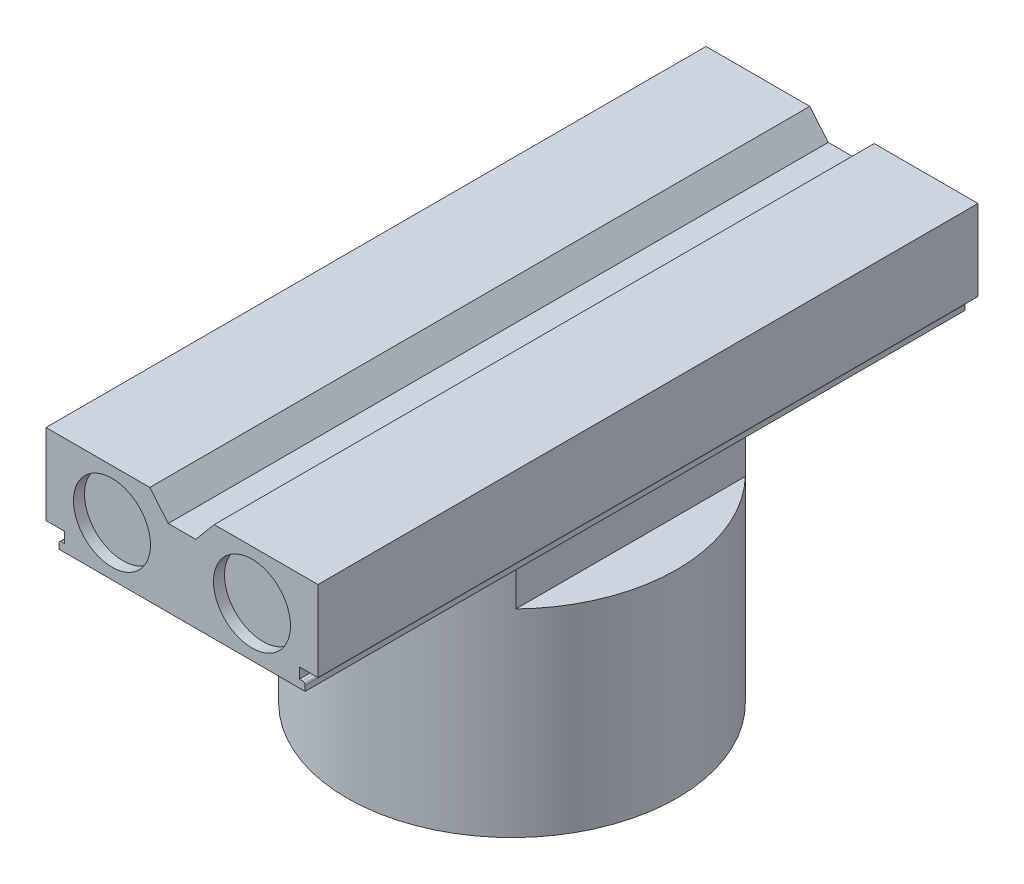
ISO-10303-21;
HEADER;
FILE_DESCRIPTION(('STEP AP214'),'2;1');
FILE_NAME('part.step','',(''),(''),'','','');
FILE_SCHEMA(('AUTOMOTIVE_DESIGN { 1 0 10303 214 1 1 1 1 }'));
ENDSEC;
DATA;
#1=APPLICATION_CONTEXT('core data for automotive mechanical design processes');
#2=APPLICATION_PROTOCOL_DEFINITION('international standard','automotive_design',2000,#1);
#3=PRODUCT_CONTEXT('',#1,'mechanical');
#4=PRODUCT('Part','Part','',(#3));
#5=PRODUCT_RELATED_PRODUCT_CATEGORY('part','',(#4));
#6=PRODUCT_DEFINITION_FORMATION('','',#4);
#7=PRODUCT_DEFINITION_CONTEXT('part definition',#1,'design');
#8=PRODUCT_DEFINITION('design','',#6,#7);
#9=PRODUCT_DEFINITION_SHAPE('','',#8);
#10=(LENGTH_UNIT() NAMED_UNIT(*) SI_UNIT(.MILLI.,.METRE.));
#11=(NAMED_UNIT(*) PLANE_ANGLE_UNIT() SI_UNIT($,.RADIAN.));
#12=(NAMED_UNIT(*) SI_UNIT($,.STERADIAN.) SOLID_ANGLE_UNIT());
#13=UNCERTAINTY_MEASURE_WITH_UNIT(LENGTH_MEASURE(1.E-05),#10,'distance_accuracy_value','');
#14=(GEOMETRIC_REPRESENTATION_CONTEXT(3) GLOBAL_UNCERTAINTY_ASSIGNED_CONTEXT((#13)) GLOBAL_UNIT_ASSIGNED_CONTEXT((#10,
#11,#12)) REPRESENTATION_CONTEXT('',''));
#15=CARTESIAN_POINT('',(0.,0.,0.));
#16=DIRECTION('',(0.,0.,1.));
#17=DIRECTION('',(1.,0.,0.));
#18=AXIS2_PLACEMENT_3D('',#15,#16,#17);
#19=CARTESIAN_POINT('',(24.7249393998215,4.00000000000023,59.9999999999995));
#20=DIRECTION('',(0.,1.,0.));
#21=DIRECTION('',(-1.,0.,0.));
#22=AXIS2_PLACEMENT_3D('',#19,#20,#21);
#23=PLANE('',#22);
#24=DIRECTION('',(0.,0.,1.));
#25=VECTOR('',#24,1.);
#26=CARTESIAN_POINT('',(5.85639852470913,4.00000000000023,59.9999999999995));
#27=LINE('',#26,#25);
#28=CARTESIAN_POINT('',(5.85639852470913,4.00000000000023,59.9999999999995));
#29=VERTEX_POINT('',#28);
#30=CARTESIAN_POINT('',(5.85639852470913,3.99999999999978,-60.0000000000005));
#31=VERTEX_POINT('',#30);
#32=EDGE_CURVE('E186',#29,#31,#27,.F.);
#33=ORIENTED_EDGE('',*,*,#32,.F.);
#34=DIRECTION('',(1.,0.,0.));
#35=VECTOR('',#34,1.);
#36=CARTESIAN_POINT('',(-24.7249393998215,4.00000000000023,59.9999999999995));
#37=LINE('',#36,#35);
#38=CARTESIAN_POINT('',(24.7249393998215,4.00000000000023,59.9999999999995));
#39=VERTEX_POINT('',#38);
#40=EDGE_CURVE('E326',#29,#39,#37,.T.);
#41=ORIENTED_EDGE('',*,*,#40,.T.);
#42=DIRECTION('',(0.,0.,-1.));
#43=VECTOR('',#42,1.);
#44=CARTESIAN_POINT('',(24.7249393998215,3.99999999999978,-60.0000000000005));
#45=LINE('',#44,#43);
#46=CARTESIAN_POINT('',(24.7249393998215,3.99999999999978,-60.0000000000005));
#47=VERTEX_POINT('',#46);
#48=EDGE_CURVE('E317',#39,#47,#45,.T.);
#49=ORIENTED_EDGE('',*,*,#48,.T.);
#50=DIRECTION('',(-1.,0.,0.));
#51=VECTOR('',#50,1.);
#52=CARTESIAN_POINT('',(-24.7249393998215,3.99999999999978,-60.0000000000005));
#53=LINE('',#52,#51);
#54=EDGE_CURVE('E322',#47,#31,#53,.T.);
#55=ORIENTED_EDGE('',*,*,#54,.T.);
#56=EDGE_LOOP('',(#33,#41,#49,#55));
#57=FACE_BOUND('',#56,.T.);
#58=ADVANCED_FACE('F34',(#57),#23,.T.);
#59=CARTESIAN_POINT('',(-24.7249393998215,4.00000000000023,59.9999999999995));
#60=DIRECTION('',(0.,0.,-1.));
#61=DIRECTION('',(-1.,0.,0.));
#62=AXIS2_PLACEMENT_3D('',#59,#60,#61);
#63=PLANE('',#62);
#64=ORIENTED_EDGE('',*,*,#40,.F.);
#65=DIRECTION('',(-0.64278760968654,-0.766044443118977,0.));
#66=VECTOR('',#65,1.);
#67=CARTESIAN_POINT('',(2.50000000000001,2.22044604925031E-13,59.9999999999995));
#68=LINE('',#67,#66);
#69=CARTESIAN_POINT('',(2.5,2.22044604925031E-13,59.9999999999995));
#70=VERTEX_POINT('',#69);
#71=EDGE_CURVE('E229',#70,#29,#68,.F.);
#72=ORIENTED_EDGE('',*,*,#71,.F.);
#73=DIRECTION('',(1.,0.,0.));
#74=VECTOR('',#73,1.);
#75=CARTESIAN_POINT('',(-2.5,2.22044604925031E-13,59.9999999999995));
#76=LINE('',#75,#74);
#77=CARTESIAN_POINT('',(-2.5,2.22044604925031E-13,59.9999999999995));
#78=VERTEX_POINT('',#77);
#79=EDGE_CURVE('E190',#78,#70,#76,.T.);
#80=ORIENTED_EDGE('',*,*,#79,.F.);
#81=DIRECTION('',(0.64278760968654,-0.766044443118977,0.));
#82=VECTOR('',#81,1.);
#83=CARTESIAN_POINT('',(-13.6524250931667,13.2909426709195,59.9999999999995));
#84=LINE('',#83,#82);
#85=CARTESIAN_POINT('',(-5.85639852470913,4.00000000000023,59.9999999999995));
#86=VERTEX_POINT('',#85);
#87=EDGE_CURVE('E38',#78,#86,#84,.F.);
#88=ORIENTED_EDGE('',*,*,#87,.T.);
#89=CARTESIAN_POINT('',(-24.7249393998215,4.00000000000023,59.9999999999995));
#90=VERTEX_POINT('',#89);
#91=EDGE_CURVE('E327',#90,#86,#37,.T.);
#92=ORIENTED_EDGE('',*,*,#91,.F.);
#93=DIRECTION('',(0.,-1.,0.));
#94=VECTOR('',#93,1.);
#95=CARTESIAN_POINT('',(-24.7249393998215,4.00000000000023,59.9999999999995));
#96=LINE('',#95,#94);
#97=CARTESIAN_POINT('',(-24.7249393998215,-10.6642159197293,59.9999999999996));
#98=VERTEX_POINT('',#97);
#99=EDGE_CURVE('E336',#90,#98,#96,.T.);
#100=ORIENTED_EDGE('',*,*,#99,.T.);
#101=DIRECTION('',(1.,0.,0.));
#102=VECTOR('',#101,1.);
#103=CARTESIAN_POINT('',(-24.7249393998215,-10.6642159197293,59.9999999999996));
#104=LINE('',#103,#102);
#105=CARTESIAN_POINT('',(-21.3562483247727,-10.6642159197293,59.9999999999996));
#106=VERTEX_POINT('',#105);
#107=EDGE_CURVE('E252',#98,#106,#104,.T.);
#108=ORIENTED_EDGE('',*,*,#107,.T.);
#109=DIRECTION('',(0.,-1.,0.));
#110=VECTOR('',#109,1.);
#111=CARTESIAN_POINT('',(-21.3562483247727,-10.6642159197293,59.9999999999996));
#112=LINE('',#111,#110);
#113=CARTESIAN_POINT('',(-21.3562483247727,-12.5896450644017,59.9999999999996));
#114=VERTEX_POINT('',#113);
#115=EDGE_CURVE('E255',#106,#114,#112,.T.);
#116=ORIENTED_EDGE('',*,*,#115,.T.);
#117=DIRECTION('',(-1.,0.,0.));
#118=VECTOR('',#117,1.);
#119=CARTESIAN_POINT('',(-21.3562483247727,-12.5896450644017,59.9999999999996));
#120=LINE('',#119,#118);
#121=CARTESIAN_POINT('',(-21.8895771507805,-12.5896450644017,59.9999999999996));
#122=VERTEX_POINT('',#121);
#123=EDGE_CURVE('E259',#114,#122,#120,.T.);
#124=ORIENTED_EDGE('',*,*,#123,.T.);
#125=CARTESIAN_POINT('',(-21.8895771507805,-13.0896450644017,59.9999999999996));
#126=DIRECTION('',(0.,0.,1.));
#127=DIRECTION('',(0.,-1.,0.));
#128=AXIS2_PLACEMENT_3D('',#125,#126,#127);
#129=CIRCLE('',#128,0.5);
#130=CARTESIAN_POINT('',(-22.3895771507805,-13.0896450644017,59.9999999999996));
#131=VERTEX_POINT('',#130);
#132=EDGE_CURVE('E262',#122,#131,#129,.T.);
#133=ORIENTED_EDGE('',*,*,#132,.T.);
#134=DIRECTION('',(0.,-1.,0.));
#135=VECTOR('',#134,1.);
#136=CARTESIAN_POINT('',(-22.3895771507805,-13.0896450644017,59.9999999999996));
#137=LINE('',#136,#135);
#138=CARTESIAN_POINT('',(-22.3895771507805,-13.9999999999998,59.9999999999996));
#139=VERTEX_POINT('',#138);
#140=EDGE_CURVE('E265',#131,#139,#137,.T.);
#141=ORIENTED_EDGE('',*,*,#140,.T.);
#142=DIRECTION('',(1.,0.,0.));
#143=VECTOR('',#142,1.);
#144=CARTESIAN_POINT('',(-24.7249393998215,-13.9999999999998,59.9999999999996));
#145=LINE('',#144,#143);
#146=CARTESIAN_POINT('',(22.3895771507805,-13.9999999999998,59.9999999999996));
#147=VERTEX_POINT('',#146);
#148=EDGE_CURVE('E321',#139,#147,#145,.T.);
#149=ORIENTED_EDGE('',*,*,#148,.T.);
#150=DIRECTION('',(0.,1.,0.));
#151=VECTOR('',#150,1.);
#152=CARTESIAN_POINT('',(22.3895771507805,-15.2425068149883,59.9999999999996));
#153=LINE('',#152,#151);
#154=CARTESIAN_POINT('',(22.3895771507805,-13.0896450644017,59.9999999999996));
#155=VERTEX_POINT('',#154);
#156=EDGE_CURVE('E222',#147,#155,#153,.T.);
#157=ORIENTED_EDGE('',*,*,#156,.T.);
#158=CARTESIAN_POINT('',(21.8895771507805,-13.0896450644017,59.9999999999996));
#159=DIRECTION('',(0.,0.,1.));
#160=DIRECTION('',(0.,1.,0.));
#161=AXIS2_PLACEMENT_3D('',#158,#159,#160);
#162=CIRCLE('',#161,0.5);
#163=CARTESIAN_POINT('',(21.8895771507805,-12.5896450644017,59.9999999999996));
#164=VERTEX_POINT('',#163);
#165=EDGE_CURVE('E209',#155,#164,#162,.T.);
#166=ORIENTED_EDGE('',*,*,#165,.T.);
#167=DIRECTION('',(-1.,0.,0.));
#168=VECTOR('',#167,1.);
#169=CARTESIAN_POINT('',(21.3562483247727,-12.5896450644016,59.9999999999996));
#170=LINE('',#169,#168);
#171=CARTESIAN_POINT('',(21.3562483247727,-12.5896450644016,59.9999999999996));
#172=VERTEX_POINT('',#171);
#173=EDGE_CURVE('E212',#164,#172,#170,.T.);
#174=ORIENTED_EDGE('',*,*,#173,.T.);
#175=DIRECTION('',(0.,1.,0.));
#176=VECTOR('',#175,1.);
#177=CARTESIAN_POINT('',(21.3562483247727,-10.6642159197292,59.9999999999996));
#178=LINE('',#177,#176);
#179=CARTESIAN_POINT('',(21.3562483247727,-10.6642159197292,59.9999999999996));
#180=VERTEX_POINT('',#179);
#181=EDGE_CURVE('E216',#172,#180,#178,.T.);
#182=ORIENTED_EDGE('',*,*,#181,.T.);
#183=DIRECTION('',(1.,0.,0.));
#184=VECTOR('',#183,1.);
#185=CARTESIAN_POINT('',(24.7249393998216,-10.6642159197292,59.9999999999996));
#186=LINE('',#185,#184);
#187=CARTESIAN_POINT('',(24.7249393998215,-10.6642159197292,59.9999999999996));
#188=VERTEX_POINT('',#187);
#189=EDGE_CURVE('E219',#180,#188,#186,.T.);
#190=ORIENTED_EDGE('',*,*,#189,.T.);
#191=DIRECTION('',(0.,-1.,0.));
#192=VECTOR('',#191,1.);
#193=CARTESIAN_POINT('',(24.7249393998215,4.00000000000023,59.9999999999995));
#194=LINE('',#193,#192);
#195=EDGE_CURVE('E330',#39,#188,#194,.T.);
#196=ORIENTED_EDGE('',*,*,#195,.F.);
#197=EDGE_LOOP('',(#64,#72,#80,#88,#92,#100,#108,#116,#124,#133,#141,#149,#157,#166,#174,#182,
#190,#196));
#198=FACE_BOUND('',#197,.T.);
#199=CARTESIAN_POINT('',(-12.7249393998215,-4.99999999999978,59.9999999999995));
#200=DIRECTION('',(0.,0.,-1.));
#201=DIRECTION('',(0.,-1.,0.));
#202=AXIS2_PLACEMENT_3D('',#199,#200,#201);
#203=CIRCLE('',#202,7.);
#204=CARTESIAN_POINT('',(-12.7249393998215,-11.9999999999998,59.9999999999996));
#205=VERTEX_POINT('',#204);
#206=EDGE_CURVE('E296',#205,#205,#203,.T.);
#207=ORIENTED_EDGE('',*,*,#206,.T.);
#208=EDGE_LOOP('',(#207));
#209=FACE_BOUND('',#208,.T.);
#210=CARTESIAN_POINT('',(12.7249393998215,-4.99999999999978,59.9999999999995));
#211=DIRECTION('',(0.,0.,-1.));
#212=DIRECTION('',(0.,-1.,0.));
#213=AXIS2_PLACEMENT_3D('',#210,#211,#212);
#214=CIRCLE('',#213,7.);
#215=CARTESIAN_POINT('',(12.7249393998215,-11.9999999999998,59.9999999999996));
#216=VERTEX_POINT('',#215);
#217=EDGE_CURVE('E284',#216,#216,#214,.T.);
#218=ORIENTED_EDGE('',*,*,#217,.T.);
#219=EDGE_LOOP('',(#218));
#220=FACE_BOUND('',#219,.T.);
#221=ADVANCED_FACE('F385',(#198,#209,#220),#63,.F.);
#222=CARTESIAN_POINT('',(0.,-14.,-4.18977760661176E-13));
#223=DIRECTION('',(0.,-1.,0.));
#224=DIRECTION('',(1.,0.,0.));
#225=AXIS2_PLACEMENT_3D('',#222,#223,#224);
#226=CYLINDRICAL_SURFACE('',#225,30.);
#227=CARTESIAN_POINT('',(0.,-14.,-4.18977760661176E-13));
#228=DIRECTION('',(0.,1.,0.));
#229=DIRECTION('',(-1.,0.,0.));
#230=AXIS2_PLACEMENT_3D('',#227,#228,#229);
#231=CIRCLE('',#230,30.);
#232=CARTESIAN_POINT('',(21.5599763803757,-14.0000000000001,-20.860666779316));
#233=VERTEX_POINT('',#232);
#234=CARTESIAN_POINT('',(-21.5599763803757,-14.0000000000001,-20.860666779316));
#235=VERTEX_POINT('',#234);
#236=EDGE_CURVE('E363',#233,#235,#231,.T.);
#237=ORIENTED_EDGE('',*,*,#236,.F.);
#238=DIRECTION('',(0.,-1.,0.));
#239=VECTOR('',#238,1.);
#240=CARTESIAN_POINT('',(21.5599763803757,-14.0000000000001,-20.860666779316));
#241=LINE('',#240,#239);
#242=CARTESIAN_POINT('',(21.5599763803757,-21.0000000000001,-20.860666779316));
#243=VERTEX_POINT('',#242);
#244=EDGE_CURVE('E351',#233,#243,#241,.T.);
#245=ORIENTED_EDGE('',*,*,#244,.T.);
#246=CARTESIAN_POINT('',(0.,-21.,-3.94537391289274E-13));
#247=DIRECTION('',(0.,1.,0.));
#248=DIRECTION('',(-1.,0.,0.));
#249=AXIS2_PLACEMENT_3D('',#246,#247,#248);
#250=CIRCLE('',#249,30.);
#251=CARTESIAN_POINT('',(21.5599763803757,-21.,20.8606667793152));
#252=VERTEX_POINT('',#251);
#253=EDGE_CURVE('E374',#252,#243,#250,.T.);
#254=ORIENTED_EDGE('',*,*,#253,.F.);
#255=DIRECTION('',(0.,-1.,0.));
#256=VECTOR('',#255,1.);
#257=CARTESIAN_POINT('',(21.5599763803757,-13.9999999999999,20.8606667793151));
#258=LINE('',#257,#256);
#259=CARTESIAN_POINT('',(21.5599763803757,-13.9999999999999,20.8606667793151));
#260=VERTEX_POINT('',#259);
#261=EDGE_CURVE('E348',#252,#260,#258,.F.);
#262=ORIENTED_EDGE('',*,*,#261,.T.);
#263=CARTESIAN_POINT('',(-21.5599763803757,-13.9999999999999,20.8606667793151));
#264=VERTEX_POINT('',#263);
#265=EDGE_CURVE('E364',#264,#260,#231,.T.);
#266=ORIENTED_EDGE('',*,*,#265,.F.);
#267=DIRECTION('',(0.,-1.,0.));
#268=VECTOR('',#267,1.);
#269=CARTESIAN_POINT('',(-21.5599763803757,-13.9999999999999,20.8606667793151));
#270=LINE('',#269,#268);
#271=CARTESIAN_POINT('',(-21.5599763803757,-21.,20.8606667793152));
#272=VERTEX_POINT('',#271);
#273=EDGE_CURVE('E360',#264,#272,#270,.T.);
#274=ORIENTED_EDGE('',*,*,#273,.T.);
#275=CARTESIAN_POINT('',(0.,-21.,-3.94537391289274E-13));
#276=DIRECTION('',(0.,1.,0.));
#277=DIRECTION('',(-1.,0.,0.));
#278=AXIS2_PLACEMENT_3D('',#275,#276,#277);
#279=CIRCLE('',#278,30.);
#280=CARTESIAN_POINT('',(-21.5599763803757,-21.0000000000001,-20.860666779316));
#281=VERTEX_POINT('',#280);
#282=EDGE_CURVE('E369',#281,#272,#279,.T.);
#283=ORIENTED_EDGE('',*,*,#282,.F.);
#284=DIRECTION('',(0.,-1.,0.));
#285=VECTOR('',#284,1.);
#286=CARTESIAN_POINT('',(-21.5599763803757,-14.0000000000001,-20.860666779316));
#287=LINE('',#286,#285);
#288=EDGE_CURVE('E357',#281,#235,#287,.F.);
#289=ORIENTED_EDGE('',*,*,#288,.T.);
#290=EDGE_LOOP('',(#237,#245,#254,#262,#266,#274,#283,#289));
#291=FACE_BOUND('',#290,.T.);
#292=CARTESIAN_POINT('',(0.,-57.,1.99014436314059E-13));
#293=DIRECTION('',(0.,-1.,0.));
#294=DIRECTION('',(0.,0.,-1.));
#295=AXIS2_PLACEMENT_3D('',#292,#293,#294);
#296=CIRCLE('',#295,30.);
#297=CARTESIAN_POINT('',(0.,-57.0000000000001,-29.9999999999998));
#298=VERTEX_POINT('',#297);
#299=EDGE_CURVE('E379',#298,#298,#296,.T.);
#300=ORIENTED_EDGE('',*,*,#299,.F.);
#301=EDGE_LOOP('',(#300));
#302=FACE_BOUND('',#301,.T.);
#303=ADVANCED_FACE('F447',(#291,#302),#226,.T.);
#304=CARTESIAN_POINT('',(-21.5599763803757,-21.0000000000001,-26.8777185439004));
#305=DIRECTION('',(0.,1.,0.));
#306=DIRECTION('',(-1.,0.,0.));
#307=AXIS2_PLACEMENT_3D('',#304,#305,#306);
#308=PLANE('',#307);
#309=ORIENTED_EDGE('',*,*,#282,.T.);
#310=DIRECTION('',(0.,0.,-1.));
#311=VECTOR('',#310,1.);
#312=CARTESIAN_POINT('',(-21.5599763803757,-20.9999999999999,26.1841000008313));
#313=LINE('',#312,#311);
#314=EDGE_CURVE('E354',#272,#281,#313,.T.);
#315=ORIENTED_EDGE('',*,*,#314,.T.);
#316=EDGE_LOOP('',(#309,#315));
#317=FACE_BOUND('',#316,.T.);
#318=ADVANCED_FACE('F477',(#317),#308,.T.);
#319=CARTESIAN_POINT('',(-21.5599763803757,-20.9999999999999,26.1841000008313));
#320=DIRECTION('',(1.,0.,0.));
#321=DIRECTION('',(0.,0.,-1.));
#322=AXIS2_PLACEMENT_3D('',#319,#320,#321);
#323=PLANE('',#322);
#324=DIRECTION('',(0.,0.,-1.));
#325=VECTOR('',#324,1.);
#326=CARTESIAN_POINT('',(-21.5599763803757,-14.,-4.16158362593466E-13));
#327=LINE('',#326,#325);
#328=EDGE_CURVE('E366',#264,#235,#327,.T.);
#329=ORIENTED_EDGE('',*,*,#328,.T.);
#330=ORIENTED_EDGE('',*,*,#288,.F.);
#331=ORIENTED_EDGE('',*,*,#314,.F.);
#332=ORIENTED_EDGE('',*,*,#273,.F.);
#333=EDGE_LOOP('',(#329,#330,#331,#332));
#334=FACE_BOUND('',#333,.T.);
#335=ADVANCED_FACE('F472',(#334),#323,.F.);
#336=CARTESIAN_POINT('',(30.9008162630705,-20.9999999999999,26.1841000008313));
#337=DIRECTION('',(0.,1.,0.));
#338=DIRECTION('',(-1.,0.,0.));
#339=AXIS2_PLACEMENT_3D('',#336,#337,#338);
#340=PLANE('',#339);
#341=ORIENTED_EDGE('',*,*,#253,.T.);
#342=DIRECTION('',(0.,0.,1.));
#343=VECTOR('',#342,1.);
#344=CARTESIAN_POINT('',(21.5599763803757,-20.9999999999999,26.1841000008313));
#345=LINE('',#344,#343);
#346=EDGE_CURVE('E345',#243,#252,#345,.T.);
#347=ORIENTED_EDGE('',*,*,#346,.T.);
#348=EDGE_LOOP('',(#341,#347));
#349=FACE_BOUND('',#348,.T.);
#350=ADVANCED_FACE('F468',(#349),#340,.T.);
#351=CARTESIAN_POINT('',(21.5599763803757,-20.9999999999999,26.1841000008313));
#352=DIRECTION('',(-1.,0.,0.));
#353=DIRECTION('',(0.,0.,1.));
#354=AXIS2_PLACEMENT_3D('',#351,#352,#353);
#355=PLANE('',#354);
#356=DIRECTION('',(0.,0.,1.));
#357=VECTOR('',#356,1.);
#358=CARTESIAN_POINT('',(21.5599763803757,-14.,-4.16158362593466E-13));
#359=LINE('',#358,#357);
#360=EDGE_CURVE('E371',#233,#260,#359,.T.);
#361=ORIENTED_EDGE('',*,*,#360,.T.);
#362=ORIENTED_EDGE('',*,*,#261,.F.);
#363=ORIENTED_EDGE('',*,*,#346,.F.);
#364=ORIENTED_EDGE('',*,*,#244,.F.);
#365=EDGE_LOOP('',(#361,#362,#363,#364));
#366=FACE_BOUND('',#365,.T.);
#367=ADVANCED_FACE('F471',(#366),#355,.F.);
#368=CARTESIAN_POINT('',(24.7249393998215,-13.9999999999998,59.9999999999996));
#369=DIRECTION('',(0.,1.,0.));
#370=DIRECTION('',(-1.,0.,0.));
#371=AXIS2_PLACEMENT_3D('',#368,#369,#370);
#372=PLANE('',#371);
#373=DIRECTION('',(-1.,0.,0.));
#374=VECTOR('',#373,1.);
#375=CARTESIAN_POINT('',(-24.7249393998215,-14.0000000000002,-60.0000000000004));
#376=LINE('',#375,#374);
#377=CARTESIAN_POINT('',(22.3895771507805,-14.0000000000002,-60.0000000000004));
#378=VERTEX_POINT('',#377);
#379=CARTESIAN_POINT('',(-22.3895771507805,-14.0000000000002,-60.0000000000004));
#380=VERTEX_POINT('',#379);
#381=EDGE_CURVE('E314',#378,#380,#376,.T.);
#382=ORIENTED_EDGE('',*,*,#381,.F.);
#383=DIRECTION('',(0.,0.,1.));
#384=VECTOR('',#383,1.);
#385=CARTESIAN_POINT('',(22.3895771507805,-13.9999999999998,59.9999999999996));
#386=LINE('',#385,#384);
#387=EDGE_CURVE('E248',#378,#147,#386,.T.);
#388=ORIENTED_EDGE('',*,*,#387,.T.);
#389=ORIENTED_EDGE('',*,*,#148,.F.);
#390=DIRECTION('',(0.,0.,-1.));
#391=VECTOR('',#390,1.);
#392=CARTESIAN_POINT('',(-22.3895771507805,-13.9999999999998,59.9999999999996));
#393=LINE('',#392,#391);
#394=EDGE_CURVE('E281',#139,#380,#393,.T.);
#395=ORIENTED_EDGE('',*,*,#394,.T.);
#396=EDGE_LOOP('',(#382,#388,#389,#395));
#397=FACE_BOUND('',#396,.T.);
#398=ORIENTED_EDGE('',*,*,#236,.T.);
#399=ORIENTED_EDGE('',*,*,#328,.F.);
#400=ORIENTED_EDGE('',*,*,#265,.T.);
#401=ORIENTED_EDGE('',*,*,#360,.F.);
#402=EDGE_LOOP('',(#398,#399,#400,#401));
#403=FACE_BOUND('',#402,.T.);
#404=ADVANCED_FACE('F416',(#397,#403),#372,.F.);
#405=CARTESIAN_POINT('',(24.7249393998215,3.99999999999978,-60.0000000000005));
#406=DIRECTION('',(-1.,0.,0.));
#407=DIRECTION('',(0.,0.,1.));
#408=AXIS2_PLACEMENT_3D('',#405,#406,#407);
#409=PLANE('',#408);
#410=ORIENTED_EDGE('',*,*,#195,.T.);
#411=DIRECTION('',(0.,0.,-1.));
#412=VECTOR('',#411,1.);
#413=CARTESIAN_POINT('',(24.7249393998215,-10.6642159197296,-60.0000000000004));
#414=LINE('',#413,#412);
#415=CARTESIAN_POINT('',(24.7249393998216,-10.6642159197296,-60.0000000000004));
#416=VERTEX_POINT('',#415);
#417=EDGE_CURVE('E239',#188,#416,#414,.T.);
#418=ORIENTED_EDGE('',*,*,#417,.T.);
#419=DIRECTION('',(0.,-1.,0.));
#420=VECTOR('',#419,1.);
#421=CARTESIAN_POINT('',(24.7249393998215,3.99999999999978,-60.0000000000005));
#422=LINE('',#421,#420);
#423=EDGE_CURVE('E342',#47,#416,#422,.T.);
#424=ORIENTED_EDGE('',*,*,#423,.F.);
#425=ORIENTED_EDGE('',*,*,#48,.F.);
#426=EDGE_LOOP('',(#410,#418,#424,#425));
#427=FACE_BOUND('',#426,.T.);
#428=ADVANCED_FACE('F439',(#427),#409,.F.);
#429=CARTESIAN_POINT('',(-24.7249393998215,3.99999999999978,-60.0000000000005));
#430=DIRECTION('',(0.,0.,1.));
#431=DIRECTION('',(1.,0.,0.));
#432=AXIS2_PLACEMENT_3D('',#429,#430,#431);
#433=PLANE('',#432);
#434=CARTESIAN_POINT('',(12.7249393998215,-5.00000000000023,-60.0000000000004));
#435=DIRECTION('',(0.,0.,-1.));
#436=DIRECTION('',(0.,-1.,0.));
#437=AXIS2_PLACEMENT_3D('',#434,#435,#436);
#438=CIRCLE('',#437,7.);
#439=CARTESIAN_POINT('',(12.7249393998215,-12.0000000000002,-60.0000000000004));
#440=VERTEX_POINT('',#439);
#441=EDGE_CURVE('E302',#440,#440,#438,.T.);
#442=ORIENTED_EDGE('',*,*,#441,.F.);
#443=EDGE_LOOP('',(#442));
#444=FACE_BOUND('',#443,.T.);
#445=CARTESIAN_POINT('',(-12.7249393998215,-5.00000000000023,-60.0000000000004));
#446=DIRECTION('',(0.,0.,-1.));
#447=DIRECTION('',(0.,-1.,0.));
#448=AXIS2_PLACEMENT_3D('',#445,#446,#447);
#449=CIRCLE('',#448,7.);
#450=CARTESIAN_POINT('',(-12.7249393998215,-12.0000000000002,-60.0000000000004));
#451=VERTEX_POINT('',#450);
#452=EDGE_CURVE('E308',#451,#451,#449,.T.);
#453=ORIENTED_EDGE('',*,*,#452,.F.);
#454=EDGE_LOOP('',(#453));
#455=FACE_BOUND('',#454,.T.);
#456=DIRECTION('',(-1.,0.,0.));
#457=VECTOR('',#456,1.);
#458=CARTESIAN_POINT('',(-2.5,-2.22044604925031E-13,-60.0000000000005));
#459=LINE('',#458,#457);
#460=CARTESIAN_POINT('',(2.5,-2.22044604925031E-13,-60.0000000000005));
#461=VERTEX_POINT('',#460);
#462=CARTESIAN_POINT('',(-2.5,-2.22044604925031E-13,-60.0000000000005));
#463=VERTEX_POINT('',#462);
#464=EDGE_CURVE('E196',#461,#463,#459,.T.);
#465=ORIENTED_EDGE('',*,*,#464,.F.);
#466=DIRECTION('',(-0.64278760968654,-0.766044443118977,0.));
#467=VECTOR('',#466,1.);
#468=CARTESIAN_POINT('',(-6.77907363695058,-11.0583693427823,-60.0000000000004));
#469=LINE('',#468,#467);
#470=EDGE_CURVE('E180',#461,#31,#469,.F.);
#471=ORIENTED_EDGE('',*,*,#470,.T.);
#472=ORIENTED_EDGE('',*,*,#54,.F.);
#473=ORIENTED_EDGE('',*,*,#423,.T.);
#474=DIRECTION('',(1.,0.,0.));
#475=VECTOR('',#474,1.);
#476=CARTESIAN_POINT('',(24.7249393998216,-10.6642159197296,-60.0000000000004));
#477=LINE('',#476,#475);
#478=CARTESIAN_POINT('',(21.3562483247727,-10.6642159197296,-60.0000000000004));
#479=VERTEX_POINT('',#478);
#480=EDGE_CURVE('E213',#479,#416,#477,.T.);
#481=ORIENTED_EDGE('',*,*,#480,.F.);
#482=DIRECTION('',(0.,1.,0.));
#483=VECTOR('',#482,1.);
#484=CARTESIAN_POINT('',(21.3562483247727,-10.6642159197296,-60.0000000000004));
#485=LINE('',#484,#483);
#486=CARTESIAN_POINT('',(21.3562483247727,-12.5896450644021,-60.0000000000004));
#487=VERTEX_POINT('',#486);
#488=EDGE_CURVE('E232',#487,#479,#485,.T.);
#489=ORIENTED_EDGE('',*,*,#488,.F.);
#490=DIRECTION('',(-1.,0.,0.));
#491=VECTOR('',#490,1.);
#492=CARTESIAN_POINT('',(21.3562483247727,-12.5896450644021,-60.0000000000004));
#493=LINE('',#492,#491);
#494=CARTESIAN_POINT('',(21.8895771507805,-12.5896450644021,-60.0000000000004));
#495=VERTEX_POINT('',#494);
#496=EDGE_CURVE('E228',#495,#487,#493,.T.);
#497=ORIENTED_EDGE('',*,*,#496,.F.);
#498=CARTESIAN_POINT('',(21.8895771507805,-13.0896450644021,-60.0000000000004));
#499=DIRECTION('',(0.,0.,1.));
#500=DIRECTION('',(0.,1.,0.));
#501=AXIS2_PLACEMENT_3D('',#498,#499,#500);
#502=CIRCLE('',#501,0.5);
#503=CARTESIAN_POINT('',(22.3895771507805,-13.0896450644021,-60.0000000000004));
#504=VERTEX_POINT('',#503);
#505=EDGE_CURVE('E226',#504,#495,#502,.T.);
#506=ORIENTED_EDGE('',*,*,#505,.F.);
#507=DIRECTION('',(0.,-1.,0.));
#508=VECTOR('',#507,1.);
#509=CARTESIAN_POINT('',(22.3895771507805,3.99999999999978,-60.0000000000005));
#510=LINE('',#509,#508);
#511=EDGE_CURVE('E11',#504,#378,#510,.T.);
#512=ORIENTED_EDGE('',*,*,#511,.T.);
#513=ORIENTED_EDGE('',*,*,#381,.T.);
#514=DIRECTION('',(0.,-1.,0.));
#515=VECTOR('',#514,1.);
#516=CARTESIAN_POINT('',(-22.3895771507805,-13.0896450644021,-60.0000000000004));
#517=LINE('',#516,#515);
#518=CARTESIAN_POINT('',(-22.3895771507805,-13.0896450644021,-60.0000000000004));
#519=VERTEX_POINT('',#518);
#520=EDGE_CURVE('E256',#519,#380,#517,.T.);
#521=ORIENTED_EDGE('',*,*,#520,.F.);
#522=CARTESIAN_POINT('',(-21.8895771507805,-13.0896450644021,-60.0000000000004));
#523=DIRECTION('',(0.,0.,1.));
#524=DIRECTION('',(0.,-1.,0.));
#525=AXIS2_PLACEMENT_3D('',#522,#523,#524);
#526=CIRCLE('',#525,0.5);
#527=CARTESIAN_POINT('',(-21.8895771507805,-12.5896450644021,-60.0000000000004));
#528=VERTEX_POINT('',#527);
#529=EDGE_CURVE('E276',#528,#519,#526,.T.);
#530=ORIENTED_EDGE('',*,*,#529,.F.);
#531=DIRECTION('',(-1.,0.,0.));
#532=VECTOR('',#531,1.);
#533=CARTESIAN_POINT('',(-21.3562483247727,-12.5896450644021,-60.0000000000004));
#534=LINE('',#533,#532);
#535=CARTESIAN_POINT('',(-21.3562483247727,-12.5896450644021,-60.0000000000004));
#536=VERTEX_POINT('',#535);
#537=EDGE_CURVE('E273',#536,#528,#534,.T.);
#538=ORIENTED_EDGE('',*,*,#537,.F.);
#539=DIRECTION('',(0.,-1.,0.));
#540=VECTOR('',#539,1.);
#541=CARTESIAN_POINT('',(-21.3562483247727,-10.6642159197297,-60.0000000000004));
#542=LINE('',#541,#540);
#543=CARTESIAN_POINT('',(-21.3562483247727,-10.6642159197297,-60.0000000000004));
#544=VERTEX_POINT('',#543);
#545=EDGE_CURVE('E270',#544,#536,#542,.T.);
#546=ORIENTED_EDGE('',*,*,#545,.F.);
#547=DIRECTION('',(1.,0.,0.));
#548=VECTOR('',#547,1.);
#549=CARTESIAN_POINT('',(-24.7249393998215,-10.6642159197297,-60.0000000000004));
#550=LINE('',#549,#548);
#551=CARTESIAN_POINT('',(-24.7249393998215,-10.6642159197297,-60.0000000000004));
#552=VERTEX_POINT('',#551);
#553=EDGE_CURVE('E251',#552,#544,#550,.T.);
#554=ORIENTED_EDGE('',*,*,#553,.F.);
#555=DIRECTION('',(0.,-1.,0.));
#556=VECTOR('',#555,1.);
#557=CARTESIAN_POINT('',(-24.7249393998215,3.99999999999978,-60.0000000000005));
#558=LINE('',#557,#556);
#559=CARTESIAN_POINT('',(-24.7249393998215,3.99999999999978,-60.0000000000005));
#560=VERTEX_POINT('',#559);
#561=EDGE_CURVE('E339',#560,#552,#558,.T.);
#562=ORIENTED_EDGE('',*,*,#561,.F.);
#563=CARTESIAN_POINT('',(-5.85639852470913,3.99999999999978,-60.0000000000005));
#564=VERTEX_POINT('',#563);
#565=EDGE_CURVE('E320',#564,#560,#53,.T.);
#566=ORIENTED_EDGE('',*,*,#565,.F.);
#567=DIRECTION('',(0.64278760968654,-0.766044443118977,0.));
#568=VECTOR('',#567,1.);
#569=CARTESIAN_POINT('',(-2.5,-2.22044604925031E-13,-60.0000000000005));
#570=LINE('',#569,#568);
#571=EDGE_CURVE('E52',#463,#564,#570,.F.);
#572=ORIENTED_EDGE('',*,*,#571,.F.);
#573=EDGE_LOOP('',(#465,#471,#472,#473,#481,#489,#497,#506,#512,#513,#521,#530,#538,#546,#554,
#562,#566,#572));
#574=FACE_BOUND('',#573,.T.);
#575=ADVANCED_FACE('F201',(#444,#455,#574),#433,.F.);
#576=CARTESIAN_POINT('',(-24.7249393998215,3.99999999999978,-60.0000000000005));
#577=DIRECTION('',(1.,0.,0.));
#578=DIRECTION('',(0.,1.,0.));
#579=AXIS2_PLACEMENT_3D('',#576,#577,#578);
#580=PLANE('',#579);
#581=ORIENTED_EDGE('',*,*,#561,.T.);
#582=DIRECTION('',(0.,0.,1.));
#583=VECTOR('',#582,1.);
#584=CARTESIAN_POINT('',(-24.7249393998215,-10.6642159197297,-60.0000000000004));
#585=LINE('',#584,#583);
#586=EDGE_CURVE('E44',#552,#98,#585,.T.);
#587=ORIENTED_EDGE('',*,*,#586,.T.);
#588=ORIENTED_EDGE('',*,*,#99,.F.);
#589=DIRECTION('',(0.,0.,1.));
#590=VECTOR('',#589,1.);
#591=CARTESIAN_POINT('',(-24.7249393998215,3.99999999999978,-60.0000000000005));
#592=LINE('',#591,#590);
#593=EDGE_CURVE('E324',#560,#90,#592,.T.);
#594=ORIENTED_EDGE('',*,*,#593,.F.);
#595=EDGE_LOOP('',(#581,#587,#588,#594));
#596=FACE_BOUND('',#595,.T.);
#597=ADVANCED_FACE('F393',(#596),#580,.F.);
#598=DIRECTION('',(0.,0.,-1.));
#599=VECTOR('',#598,1.);
#600=CARTESIAN_POINT('',(-5.85639852470913,4.00000000000023,59.9999999999995));
#601=LINE('',#600,#599);
#602=EDGE_CURVE('E199',#564,#86,#601,.F.);
#603=ORIENTED_EDGE('',*,*,#602,.F.);
#604=ORIENTED_EDGE('',*,*,#565,.T.);
#605=ORIENTED_EDGE('',*,*,#593,.T.);
#606=ORIENTED_EDGE('',*,*,#91,.T.);
#607=EDGE_LOOP('',(#603,#604,#605,#606));
#608=FACE_BOUND('',#607,.T.);
#609=ADVANCED_FACE('F388',(#608),#23,.T.);
#610=CARTESIAN_POINT('',(-12.7249393998215,-5.0000000000002,-58.0000000000004));
#611=DIRECTION('',(0.,0.,-1.));
#612=DIRECTION('',(0.,-1.,0.));
#613=AXIS2_PLACEMENT_3D('',#610,#611,#612);
#614=CYLINDRICAL_SURFACE('',#613,7.);
#615=CARTESIAN_POINT('',(-12.7249393998215,-5.0000000000002,-58.0000000000004));
#616=DIRECTION('',(0.,0.,-1.));
#617=DIRECTION('',(0.,-1.,0.));
#618=AXIS2_PLACEMENT_3D('',#615,#616,#617);
#619=CIRCLE('',#618,7.);
#620=CARTESIAN_POINT('',(-12.7249393998215,-12.0000000000002,-58.0000000000004));
#621=VERTEX_POINT('',#620);
#622=EDGE_CURVE('E311',#621,#621,#619,.T.);
#623=ORIENTED_EDGE('',*,*,#622,.F.);
#624=EDGE_LOOP('',(#623));
#625=FACE_BOUND('',#624,.T.);
#626=ORIENTED_EDGE('',*,*,#452,.T.);
#627=EDGE_LOOP('',(#626));
#628=FACE_BOUND('',#627,.T.);
#629=ADVANCED_FACE('F452',(#625,#628),#614,.F.);
#630=CARTESIAN_POINT('',(-12.7249393998215,-5.0000000000002,-58.0000000000004));
#631=DIRECTION('',(0.,0.,-1.));
#632=DIRECTION('',(0.,-1.,0.));
#633=AXIS2_PLACEMENT_3D('',#630,#631,#632);
#634=PLANE('',#633);
#635=ORIENTED_EDGE('',*,*,#622,.T.);
#636=EDGE_LOOP('',(#635));
#637=FACE_BOUND('',#636,.T.);
#638=ADVANCED_FACE('F457',(#637),#634,.T.);
#639=CARTESIAN_POINT('',(12.7249393998215,-5.0000000000002,-58.0000000000004));
#640=DIRECTION('',(0.,0.,-1.));
#641=DIRECTION('',(0.,-1.,0.));
#642=AXIS2_PLACEMENT_3D('',#639,#640,#641);
#643=CYLINDRICAL_SURFACE('',#642,7.);
#644=CARTESIAN_POINT('',(12.7249393998215,-5.0000000000002,-58.0000000000004));
#645=DIRECTION('',(0.,0.,-1.));
#646=DIRECTION('',(0.,-1.,0.));
#647=AXIS2_PLACEMENT_3D('',#644,#645,#646);
#648=CIRCLE('',#647,7.);
#649=CARTESIAN_POINT('',(12.7249393998215,-12.0000000000002,-58.0000000000004));
#650=VERTEX_POINT('',#649);
#651=EDGE_CURVE('E305',#650,#650,#648,.T.);
#652=ORIENTED_EDGE('',*,*,#651,.F.);
#653=EDGE_LOOP('',(#652));
#654=FACE_BOUND('',#653,.T.);
#655=ORIENTED_EDGE('',*,*,#441,.T.);
#656=EDGE_LOOP('',(#655));
#657=FACE_BOUND('',#656,.T.);
#658=ADVANCED_FACE('F529',(#654,#657),#643,.F.);
#659=CARTESIAN_POINT('',(12.7249393998215,-5.0000000000002,-58.0000000000004));
#660=DIRECTION('',(0.,0.,-1.));
#661=DIRECTION('',(0.,-1.,0.));
#662=AXIS2_PLACEMENT_3D('',#659,#660,#661);
#663=PLANE('',#662);
#664=ORIENTED_EDGE('',*,*,#651,.T.);
#665=EDGE_LOOP('',(#664));
#666=FACE_BOUND('',#665,.T.);
#667=ADVANCED_FACE('F525',(#666),#663,.T.);
#668=CARTESIAN_POINT('',(-12.7249393998215,-4.99999999999981,57.9999999999995));
#669=DIRECTION('',(0.,0.,1.));
#670=DIRECTION('',(0.,1.,0.));
#671=AXIS2_PLACEMENT_3D('',#668,#669,#670);
#672=CYLINDRICAL_SURFACE('',#671,7.);
#673=CARTESIAN_POINT('',(-12.7249393998215,-4.99999999999981,57.9999999999995));
#674=DIRECTION('',(0.,0.,-1.));
#675=DIRECTION('',(0.,-1.,0.));
#676=AXIS2_PLACEMENT_3D('',#673,#674,#675);
#677=CIRCLE('',#676,7.);
#678=CARTESIAN_POINT('',(-12.7249393998215,-11.9999999999998,57.9999999999996));
#679=VERTEX_POINT('',#678);
#680=EDGE_CURVE('E299',#679,#679,#677,.T.);
#681=ORIENTED_EDGE('',*,*,#680,.T.);
#682=EDGE_LOOP('',(#681));
#683=FACE_BOUND('',#682,.T.);
#684=ORIENTED_EDGE('',*,*,#206,.F.);
#685=EDGE_LOOP('',(#684));
#686=FACE_BOUND('',#685,.T.);
#687=ADVANCED_FACE('F521',(#683,#686),#672,.F.);
#688=CARTESIAN_POINT('',(-12.7249393998215,-4.99999999999981,57.9999999999995));
#689=DIRECTION('',(0.,0.,1.));
#690=DIRECTION('',(0.,-1.,0.));
#691=AXIS2_PLACEMENT_3D('',#688,#689,#690);
#692=PLANE('',#691);
#693=ORIENTED_EDGE('',*,*,#680,.F.);
#694=EDGE_LOOP('',(#693));
#695=FACE_BOUND('',#694,.T.);
#696=ADVANCED_FACE('F517',(#695),#692,.T.);
#697=CARTESIAN_POINT('',(12.7249393998215,-4.99999999999981,57.9999999999995));
#698=DIRECTION('',(0.,0.,1.));
#699=DIRECTION('',(0.,1.,0.));
#700=AXIS2_PLACEMENT_3D('',#697,#698,#699);
#701=CYLINDRICAL_SURFACE('',#700,7.);
#702=CARTESIAN_POINT('',(12.7249393998215,-4.99999999999981,57.9999999999995));
#703=DIRECTION('',(0.,0.,-1.));
#704=DIRECTION('',(0.,-1.,0.));
#705=AXIS2_PLACEMENT_3D('',#702,#703,#704);
#706=CIRCLE('',#705,7.);
#707=CARTESIAN_POINT('',(12.7249393998215,-11.9999999999998,57.9999999999996));
#708=VERTEX_POINT('',#707);
#709=EDGE_CURVE('E293',#708,#708,#706,.T.);
#710=ORIENTED_EDGE('',*,*,#709,.T.);
#711=EDGE_LOOP('',(#710));
#712=FACE_BOUND('',#711,.T.);
#713=ORIENTED_EDGE('',*,*,#217,.F.);
#714=EDGE_LOOP('',(#713));
#715=FACE_BOUND('',#714,.T.);
#716=ADVANCED_FACE('F513',(#712,#715),#701,.F.);
#717=CARTESIAN_POINT('',(12.7249393998215,-4.99999999999981,57.9999999999995));
#718=DIRECTION('',(0.,0.,1.));
#719=DIRECTION('',(0.,-1.,0.));
#720=AXIS2_PLACEMENT_3D('',#717,#718,#719);
#721=PLANE('',#720);
#722=ORIENTED_EDGE('',*,*,#709,.F.);
#723=EDGE_LOOP('',(#722));
#724=FACE_BOUND('',#723,.T.);
#725=ADVANCED_FACE('F510',(#724),#721,.T.);
#726=CARTESIAN_POINT('',(-24.7249393998215,-10.6642159197293,59.9999999999996));
#727=DIRECTION('',(0.,1.,0.));
#728=DIRECTION('',(-1.,0.,0.));
#729=AXIS2_PLACEMENT_3D('',#726,#727,#728);
#730=PLANE('',#729);
#731=ORIENTED_EDGE('',*,*,#553,.T.);
#732=DIRECTION('',(0.,0.,-1.));
#733=VECTOR('',#732,1.);
#734=CARTESIAN_POINT('',(-21.3562483247727,-10.6642159197293,59.9999999999996));
#735=LINE('',#734,#733);
#736=EDGE_CURVE('E268',#106,#544,#735,.T.);
#737=ORIENTED_EDGE('',*,*,#736,.F.);
#738=ORIENTED_EDGE('',*,*,#107,.F.);
#739=ORIENTED_EDGE('',*,*,#586,.F.);
#740=EDGE_LOOP('',(#731,#737,#738,#739));
#741=FACE_BOUND('',#740,.T.);
#742=ADVANCED_FACE('F396',(#741),#730,.F.);
#743=CARTESIAN_POINT('',(-22.3895771507805,-13.0896450644017,59.9999999999996));
#744=DIRECTION('',(1.,0.,0.));
#745=DIRECTION('',(0.,1.,0.));
#746=AXIS2_PLACEMENT_3D('',#743,#744,#745);
#747=PLANE('',#746);
#748=ORIENTED_EDGE('',*,*,#520,.T.);
#749=ORIENTED_EDGE('',*,*,#394,.F.);
#750=ORIENTED_EDGE('',*,*,#140,.F.);
#751=DIRECTION('',(0.,0.,-1.));
#752=VECTOR('',#751,1.);
#753=CARTESIAN_POINT('',(-22.3895771507805,-13.0896450644017,59.9999999999996));
#754=LINE('',#753,#752);
#755=EDGE_CURVE('E285',#131,#519,#754,.T.);
#756=ORIENTED_EDGE('',*,*,#755,.T.);
#757=EDGE_LOOP('',(#748,#749,#750,#756));
#758=FACE_BOUND('',#757,.T.);
#759=ADVANCED_FACE('F413',(#758),#747,.F.);
#760=CARTESIAN_POINT('',(-21.8895771507805,-13.0896450644017,59.9999999999996));
#761=DIRECTION('',(0.,0.,-1.));
#762=DIRECTION('',(0.,-1.,0.));
#763=AXIS2_PLACEMENT_3D('',#760,#761,#762);
#764=CYLINDRICAL_SURFACE('',#763,0.5);
#765=ORIENTED_EDGE('',*,*,#529,.T.);
#766=ORIENTED_EDGE('',*,*,#755,.F.);
#767=ORIENTED_EDGE('',*,*,#132,.F.);
#768=DIRECTION('',(0.,0.,-1.));
#769=VECTOR('',#768,1.);
#770=CARTESIAN_POINT('',(-21.8895771507805,-12.5896450644017,59.9999999999996));
#771=LINE('',#770,#769);
#772=EDGE_CURVE('E287',#122,#528,#771,.T.);
#773=ORIENTED_EDGE('',*,*,#772,.T.);
#774=EDGE_LOOP('',(#765,#766,#767,#773));
#775=FACE_BOUND('',#774,.T.);
#776=ADVANCED_FACE('F409',(#775),#764,.T.);
#777=CARTESIAN_POINT('',(-21.3562483247727,-12.5896450644017,59.9999999999996));
#778=DIRECTION('',(0.,-1.,0.));
#779=DIRECTION('',(1.,0.,0.));
#780=AXIS2_PLACEMENT_3D('',#777,#778,#779);
#781=PLANE('',#780);
#782=ORIENTED_EDGE('',*,*,#537,.T.);
#783=ORIENTED_EDGE('',*,*,#772,.F.);
#784=ORIENTED_EDGE('',*,*,#123,.F.);
#785=DIRECTION('',(0.,0.,-1.));
#786=VECTOR('',#785,1.);
#787=CARTESIAN_POINT('',(-21.3562483247727,-12.5896450644017,59.9999999999996));
#788=LINE('',#787,#786);
#789=EDGE_CURVE('E289',#114,#536,#788,.T.);
#790=ORIENTED_EDGE('',*,*,#789,.T.);
#791=EDGE_LOOP('',(#782,#783,#784,#790));
#792=FACE_BOUND('',#791,.T.);
#793=ADVANCED_FACE('F404',(#792),#781,.F.);
#794=CARTESIAN_POINT('',(-21.3562483247727,-10.6642159197293,59.9999999999996));
#795=DIRECTION('',(1.,0.,0.));
#796=DIRECTION('',(0.,1.,0.));
#797=AXIS2_PLACEMENT_3D('',#794,#795,#796);
#798=PLANE('',#797);
#799=ORIENTED_EDGE('',*,*,#545,.T.);
#800=ORIENTED_EDGE('',*,*,#789,.F.);
#801=ORIENTED_EDGE('',*,*,#115,.F.);
#802=ORIENTED_EDGE('',*,*,#736,.T.);
#803=EDGE_LOOP('',(#799,#800,#801,#802));
#804=FACE_BOUND('',#803,.T.);
#805=ADVANCED_FACE('F400',(#804),#798,.F.);
#806=CARTESIAN_POINT('',(22.3895771507805,-13.0896450644017,59.9999999999996));
#807=DIRECTION('',(-1.,0.,0.));
#808=DIRECTION('',(0.,-1.,0.));
#809=AXIS2_PLACEMENT_3D('',#806,#807,#808);
#810=PLANE('',#809);
#811=ORIENTED_EDGE('',*,*,#511,.F.);
#812=DIRECTION('',(0.,0.,-1.));
#813=VECTOR('',#812,1.);
#814=CARTESIAN_POINT('',(22.3895771507805,-13.0896450644017,59.9999999999996));
#815=LINE('',#814,#813);
#816=EDGE_CURVE('E236',#155,#504,#815,.T.);
#817=ORIENTED_EDGE('',*,*,#816,.F.);
#818=ORIENTED_EDGE('',*,*,#156,.F.);
#819=ORIENTED_EDGE('',*,*,#387,.F.);
#820=EDGE_LOOP('',(#811,#817,#818,#819));
#821=FACE_BOUND('',#820,.T.);
#822=ADVANCED_FACE('F420',(#821),#810,.F.);
#823=CARTESIAN_POINT('',(24.7249393998216,-10.6642159197292,59.9999999999996));
#824=DIRECTION('',(0.,1.,0.));
#825=DIRECTION('',(-1.,0.,0.));
#826=AXIS2_PLACEMENT_3D('',#823,#824,#825);
#827=PLANE('',#826);
#828=ORIENTED_EDGE('',*,*,#189,.F.);
#829=DIRECTION('',(0.,0.,-1.));
#830=VECTOR('',#829,1.);
#831=CARTESIAN_POINT('',(21.3562483247727,-10.6642159197292,59.9999999999996));
#832=LINE('',#831,#830);
#833=EDGE_CURVE('E240',#180,#479,#832,.T.);
#834=ORIENTED_EDGE('',*,*,#833,.T.);
#835=ORIENTED_EDGE('',*,*,#480,.T.);
#836=ORIENTED_EDGE('',*,*,#417,.F.);
#837=EDGE_LOOP('',(#828,#834,#835,#836));
#838=FACE_BOUND('',#837,.T.);
#839=ADVANCED_FACE('F436',(#838),#827,.F.);
#840=CARTESIAN_POINT('',(21.8895771507805,-13.0896450644017,59.9999999999996));
#841=DIRECTION('',(0.,0.,-1.));
#842=DIRECTION('',(0.,-1.,0.));
#843=AXIS2_PLACEMENT_3D('',#840,#841,#842);
#844=CYLINDRICAL_SURFACE('',#843,0.5);
#845=ORIENTED_EDGE('',*,*,#505,.T.);
#846=DIRECTION('',(0.,0.,-1.));
#847=VECTOR('',#846,1.);
#848=CARTESIAN_POINT('',(21.8895771507805,-12.5896450644017,59.9999999999996));
#849=LINE('',#848,#847);
#850=EDGE_CURVE('E225',#164,#495,#849,.T.);
#851=ORIENTED_EDGE('',*,*,#850,.F.);
#852=ORIENTED_EDGE('',*,*,#165,.F.);
#853=ORIENTED_EDGE('',*,*,#816,.T.);
#854=EDGE_LOOP('',(#845,#851,#852,#853));
#855=FACE_BOUND('',#854,.T.);
#856=ADVANCED_FACE('F423',(#855),#844,.T.);
#857=CARTESIAN_POINT('',(21.3562483247727,-10.6642159197292,59.9999999999996));
#858=DIRECTION('',(-1.,0.,0.));
#859=DIRECTION('',(0.,-1.,0.));
#860=AXIS2_PLACEMENT_3D('',#857,#858,#859);
#861=PLANE('',#860);
#862=ORIENTED_EDGE('',*,*,#488,.T.);
#863=ORIENTED_EDGE('',*,*,#833,.F.);
#864=ORIENTED_EDGE('',*,*,#181,.F.);
#865=DIRECTION('',(0.,0.,-1.));
#866=VECTOR('',#865,1.);
#867=CARTESIAN_POINT('',(21.3562483247727,-12.5896450644016,59.9999999999996));
#868=LINE('',#867,#866);
#869=EDGE_CURVE('E242',#172,#487,#868,.T.);
#870=ORIENTED_EDGE('',*,*,#869,.T.);
#871=EDGE_LOOP('',(#862,#863,#864,#870));
#872=FACE_BOUND('',#871,.T.);
#873=ADVANCED_FACE('F432',(#872),#861,.F.);
#874=CARTESIAN_POINT('',(21.3562483247727,-12.5896450644016,59.9999999999996));
#875=DIRECTION('',(0.,-1.,0.));
#876=DIRECTION('',(1.,0.,0.));
#877=AXIS2_PLACEMENT_3D('',#874,#875,#876);
#878=PLANE('',#877);
#879=ORIENTED_EDGE('',*,*,#496,.T.);
#880=ORIENTED_EDGE('',*,*,#869,.F.);
#881=ORIENTED_EDGE('',*,*,#173,.F.);
#882=ORIENTED_EDGE('',*,*,#850,.T.);
#883=EDGE_LOOP('',(#879,#880,#881,#882));
#884=FACE_BOUND('',#883,.T.);
#885=ADVANCED_FACE('F427',(#884),#878,.F.);
#886=CARTESIAN_POINT('',(2.5,-2.22044604925031E-13,-60.0000000000005));
#887=DIRECTION('',(-0.766044443118977,0.64278760968654,0.));
#888=DIRECTION('',(-0.64278760968654,-0.766044443118977,0.));
#889=AXIS2_PLACEMENT_3D('',#886,#887,#888);
#890=PLANE('',#889);
#891=ORIENTED_EDGE('',*,*,#32,.T.);
#892=ORIENTED_EDGE('',*,*,#470,.F.);
#893=DIRECTION('',(0.,0.,-1.));
#894=VECTOR('',#893,1.);
#895=CARTESIAN_POINT('',(2.5,-2.22044604925031E-13,-60.0000000000005));
#896=LINE('',#895,#894);
#897=EDGE_CURVE('E183',#70,#461,#896,.T.);
#898=ORIENTED_EDGE('',*,*,#897,.F.);
#899=ORIENTED_EDGE('',*,*,#71,.T.);
#900=EDGE_LOOP('',(#891,#892,#898,#899));
#901=FACE_BOUND('',#900,.T.);
#902=ADVANCED_FACE('F182',(#901),#890,.T.);
#903=CARTESIAN_POINT('',(-2.5,-2.22044604925031E-13,-60.0000000000005));
#904=DIRECTION('',(0.766044443118977,0.64278760968654,0.));
#905=DIRECTION('',(-0.64278760968654,0.766044443118977,0.));
#906=AXIS2_PLACEMENT_3D('',#903,#904,#905);
#907=PLANE('',#906);
#908=ORIENTED_EDGE('',*,*,#602,.T.);
#909=ORIENTED_EDGE('',*,*,#87,.F.);
#910=DIRECTION('',(0.,0.,1.));
#911=VECTOR('',#910,1.);
#912=CARTESIAN_POINT('',(-2.5,-2.22044604925031E-13,-60.0000000000005));
#913=LINE('',#912,#911);
#914=EDGE_CURVE('E203',#463,#78,#913,.T.);
#915=ORIENTED_EDGE('',*,*,#914,.F.);
#916=ORIENTED_EDGE('',*,*,#571,.T.);
#917=EDGE_LOOP('',(#908,#909,#915,#916));
#918=FACE_BOUND('',#917,.T.);
#919=ADVANCED_FACE('F36',(#918),#907,.T.);
#920=CARTESIAN_POINT('',(2.5,2.22044604925031E-13,59.9999999999995));
#921=DIRECTION('',(0.,1.,0.));
#922=DIRECTION('',(-1.,0.,0.));
#923=AXIS2_PLACEMENT_3D('',#920,#921,#922);
#924=PLANE('',#923);
#925=ORIENTED_EDGE('',*,*,#897,.T.);
#926=ORIENTED_EDGE('',*,*,#464,.T.);
#927=ORIENTED_EDGE('',*,*,#914,.T.);
#928=ORIENTED_EDGE('',*,*,#79,.T.);
#929=EDGE_LOOP('',(#925,#926,#927,#928));
#930=FACE_BOUND('',#929,.T.);
#931=ADVANCED_FACE('F194',(#930),#924,.T.);
#932=CARTESIAN_POINT('',(0.,-57.,1.99014436314059E-13));
#933=DIRECTION('',(0.,-1.,0.));
#934=DIRECTION('',(0.,0.,-1.));
#935=AXIS2_PLACEMENT_3D('',#932,#933,#934);
#936=PLANE('',#935);
#937=ORIENTED_EDGE('',*,*,#299,.T.);
#938=EDGE_LOOP('',(#937));
#939=FACE_BOUND('',#938,.T.);
#940=ADVANCED_FACE('F631',(#939),#936,.T.);
#941=CLOSED_SHELL('',(#58,#221,#303,#318,#335,#350,#367,#404,#428,#575,#597,#609,#629,#638,#658,
#667,#687,#696,#716,#725,#742,#759,#776,#793,#805,#822,#839,#856,#873,#885,#902,#919,#931,#940));
#942=MANIFOLD_SOLID_BREP('B2',#941);
#943=ADVANCED_BREP_SHAPE_REPRESENTATION('',(#18,#942),#14);
#944=SHAPE_DEFINITION_REPRESENTATION(#9,#943);
ENDSEC;
END-ISO-10303-21;
